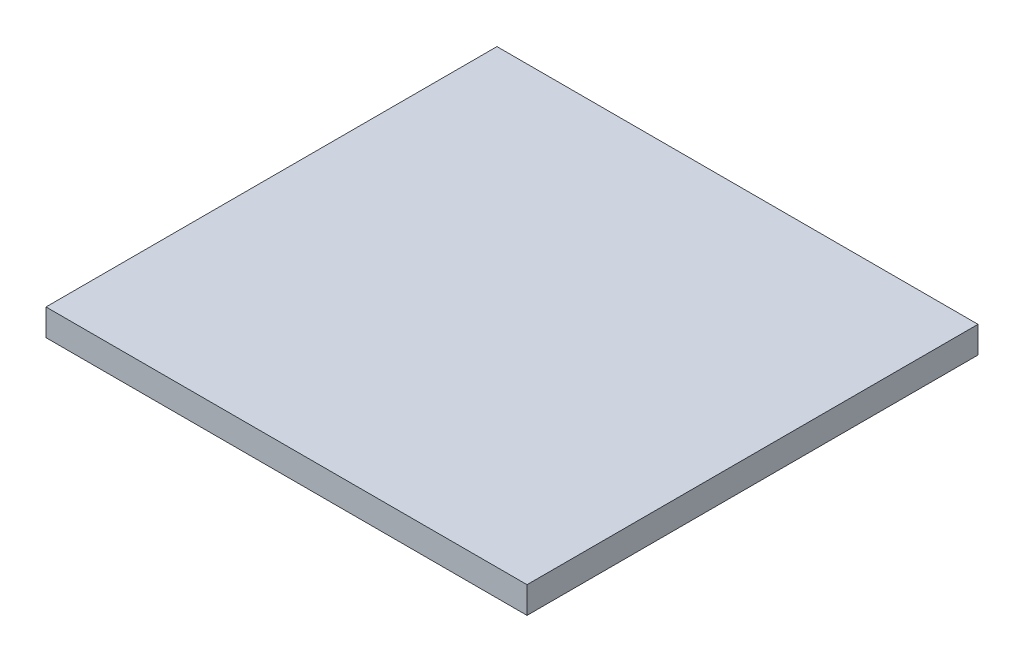
ISO-10303-21;
HEADER;
FILE_DESCRIPTION(('STEP AP214'),'2;1');
FILE_NAME('part.step','',(''),(''),'','','');
FILE_SCHEMA(('AUTOMOTIVE_DESIGN { 1 0 10303 214 1 1 1 1 }'));
ENDSEC;
DATA;
#1=APPLICATION_CONTEXT('core data for automotive mechanical design processes');
#2=APPLICATION_PROTOCOL_DEFINITION('international standard','automotive_design',2000,#1);
#3=PRODUCT_CONTEXT('',#1,'mechanical');
#4=PRODUCT('Part','Part','',(#3));
#5=PRODUCT_RELATED_PRODUCT_CATEGORY('part','',(#4));
#6=PRODUCT_DEFINITION_FORMATION('','',#4);
#7=PRODUCT_DEFINITION_CONTEXT('part definition',#1,'design');
#8=PRODUCT_DEFINITION('design','',#6,#7);
#9=PRODUCT_DEFINITION_SHAPE('','',#8);
#10=(LENGTH_UNIT() NAMED_UNIT(*) SI_UNIT(.MILLI.,.METRE.));
#11=(NAMED_UNIT(*) PLANE_ANGLE_UNIT() SI_UNIT($,.RADIAN.));
#12=(NAMED_UNIT(*) SI_UNIT($,.STERADIAN.) SOLID_ANGLE_UNIT());
#13=UNCERTAINTY_MEASURE_WITH_UNIT(LENGTH_MEASURE(1.E-05),#10,'distance_accuracy_value','');
#14=(GEOMETRIC_REPRESENTATION_CONTEXT(3) GLOBAL_UNCERTAINTY_ASSIGNED_CONTEXT((#13)) GLOBAL_UNIT_ASSIGNED_CONTEXT((#10,
#11,#12)) REPRESENTATION_CONTEXT('',''));
#15=CARTESIAN_POINT('',(0.,0.,0.));
#16=DIRECTION('',(0.,0.,1.));
#17=DIRECTION('',(1.,0.,0.));
#18=AXIS2_PLACEMENT_3D('',#15,#16,#17);
#19=CARTESIAN_POINT('',(-3.9751,2.9756,1.7526));
#20=DIRECTION('',(1.,0.,0.));
#21=DIRECTION('',(0.,-1.,0.));
#22=AXIS2_PLACEMENT_3D('',#19,#20,#21);
#23=PLANE('',#22);
#24=DIRECTION('',(0.,0.,1.));
#25=VECTOR('',#24,1.);
#26=CARTESIAN_POINT('',(-3.9751,2.9306,1.7526));
#27=LINE('',#26,#25);
#28=CARTESIAN_POINT('',(-3.9751,2.9306,0.990599999999973));
#29=VERTEX_POINT('',#28);
#30=CARTESIAN_POINT('',(-3.9751,2.9306,1.7526));
#31=VERTEX_POINT('',#30);
#32=EDGE_CURVE('E11',#29,#31,#27,.T.);
#33=ORIENTED_EDGE('',*,*,#32,.T.);
#34=DIRECTION('',(0.,-1.,0.));
#35=VECTOR('',#34,1.);
#36=CARTESIAN_POINT('',(-3.9751,2.9756,1.7526));
#37=LINE('',#36,#35);
#38=CARTESIAN_POINT('',(-3.9751,2.9756,1.7526));
#39=VERTEX_POINT('',#38);
#40=EDGE_CURVE('E24',#39,#31,#37,.T.);
#41=ORIENTED_EDGE('',*,*,#40,.F.);
#42=DIRECTION('',(0.,0.,1.));
#43=VECTOR('',#42,1.);
#44=CARTESIAN_POINT('',(-3.9751,2.9756,1.7526));
#45=LINE('',#44,#43);
#46=CARTESIAN_POINT('',(-3.9751,2.9756,0.990599999999973));
#47=VERTEX_POINT('',#46);
#48=EDGE_CURVE('E88',#47,#39,#45,.T.);
#49=ORIENTED_EDGE('',*,*,#48,.F.);
#50=DIRECTION('',(0.,-1.,0.));
#51=VECTOR('',#50,1.);
#52=CARTESIAN_POINT('',(-3.9751,2.9756,0.990599999999973));
#53=LINE('',#52,#51);
#54=EDGE_CURVE('E77',#47,#29,#53,.T.);
#55=ORIENTED_EDGE('',*,*,#54,.T.);
#56=EDGE_LOOP('',(#33,#41,#49,#55));
#57=FACE_BOUND('',#56,.T.);
#58=ADVANCED_FACE('F17',(#57),#23,.F.);
#59=CARTESIAN_POINT('',(-3.1623,2.9756,1.7526));
#60=DIRECTION('',(0.,0.,-1.));
#61=DIRECTION('',(0.,1.,0.));
#62=AXIS2_PLACEMENT_3D('',#59,#60,#61);
#63=PLANE('',#62);
#64=DIRECTION('',(1.,0.,0.));
#65=VECTOR('',#64,1.);
#66=CARTESIAN_POINT('',(-3.1623,2.9306,1.7526));
#67=LINE('',#66,#65);
#68=CARTESIAN_POINT('',(-3.1623,2.9306,1.7526));
#69=VERTEX_POINT('',#68);
#70=EDGE_CURVE('E85',#31,#69,#67,.T.);
#71=ORIENTED_EDGE('',*,*,#70,.T.);
#72=DIRECTION('',(0.,-1.,0.));
#73=VECTOR('',#72,1.);
#74=CARTESIAN_POINT('',(-3.1623,2.9756,1.7526));
#75=LINE('',#74,#73);
#76=CARTESIAN_POINT('',(-3.1623,2.9756,1.7526));
#77=VERTEX_POINT('',#76);
#78=EDGE_CURVE('E83',#77,#69,#75,.T.);
#79=ORIENTED_EDGE('',*,*,#78,.F.);
#80=DIRECTION('',(1.,0.,0.));
#81=VECTOR('',#80,1.);
#82=CARTESIAN_POINT('',(-3.1623,2.9756,1.7526));
#83=LINE('',#82,#81);
#84=EDGE_CURVE('E72',#39,#77,#83,.T.);
#85=ORIENTED_EDGE('',*,*,#84,.F.);
#86=ORIENTED_EDGE('',*,*,#40,.T.);
#87=EDGE_LOOP('',(#71,#79,#85,#86));
#88=FACE_BOUND('',#87,.T.);
#89=ADVANCED_FACE('F90',(#88),#63,.F.);
#90=CARTESIAN_POINT('',(-3.1623,2.9756,0.990599999999973));
#91=DIRECTION('',(-1.,0.,0.));
#92=DIRECTION('',(0.,1.,0.));
#93=AXIS2_PLACEMENT_3D('',#90,#91,#92);
#94=PLANE('',#93);
#95=DIRECTION('',(0.,0.,-1.));
#96=VECTOR('',#95,1.);
#97=CARTESIAN_POINT('',(-3.1623,2.9306,0.990599999999973));
#98=LINE('',#97,#96);
#99=CARTESIAN_POINT('',(-3.1623,2.9306,0.990599999999973));
#100=VERTEX_POINT('',#99);
#101=EDGE_CURVE('E60',#69,#100,#98,.T.);
#102=ORIENTED_EDGE('',*,*,#101,.T.);
#103=DIRECTION('',(0.,-1.,0.));
#104=VECTOR('',#103,1.);
#105=CARTESIAN_POINT('',(-3.1623,2.9756,0.990599999999973));
#106=LINE('',#105,#104);
#107=CARTESIAN_POINT('',(-3.1623,2.9756,0.990599999999973));
#108=VERTEX_POINT('',#107);
#109=EDGE_CURVE('E54',#108,#100,#106,.T.);
#110=ORIENTED_EDGE('',*,*,#109,.F.);
#111=DIRECTION('',(0.,0.,-1.));
#112=VECTOR('',#111,1.);
#113=CARTESIAN_POINT('',(-3.1623,2.9756,0.990599999999973));
#114=LINE('',#113,#112);
#115=EDGE_CURVE('E58',#77,#108,#114,.T.);
#116=ORIENTED_EDGE('',*,*,#115,.F.);
#117=ORIENTED_EDGE('',*,*,#78,.T.);
#118=EDGE_LOOP('',(#102,#110,#116,#117));
#119=FACE_BOUND('',#118,.T.);
#120=ADVANCED_FACE('F56',(#119),#94,.F.);
#121=CARTESIAN_POINT('',(-3.9751,2.9756,0.990599999999973));
#122=DIRECTION('',(0.,0.,1.));
#123=DIRECTION('',(0.,-1.,0.));
#124=AXIS2_PLACEMENT_3D('',#121,#122,#123);
#125=PLANE('',#124);
#126=DIRECTION('',(-1.,0.,0.));
#127=VECTOR('',#126,1.);
#128=CARTESIAN_POINT('',(-3.9751,2.9306,0.990599999999973));
#129=LINE('',#128,#127);
#130=EDGE_CURVE('E73',#100,#29,#129,.T.);
#131=ORIENTED_EDGE('',*,*,#130,.T.);
#132=ORIENTED_EDGE('',*,*,#54,.F.);
#133=DIRECTION('',(-1.,0.,0.));
#134=VECTOR('',#133,1.);
#135=CARTESIAN_POINT('',(-3.9751,2.9756,0.990599999999973));
#136=LINE('',#135,#134);
#137=EDGE_CURVE('E70',#108,#47,#136,.T.);
#138=ORIENTED_EDGE('',*,*,#137,.F.);
#139=ORIENTED_EDGE('',*,*,#109,.T.);
#140=EDGE_LOOP('',(#131,#132,#138,#139));
#141=FACE_BOUND('',#140,.T.);
#142=ADVANCED_FACE('F76',(#141),#125,.F.);
#143=CARTESIAN_POINT('',(0.,2.9756,0.));
#144=DIRECTION('',(0.,-1.,0.));
#145=DIRECTION('',(-1.,0.,0.));
#146=AXIS2_PLACEMENT_3D('',#143,#144,#145);
#147=PLANE('',#146);
#148=ORIENTED_EDGE('',*,*,#48,.T.);
#149=ORIENTED_EDGE('',*,*,#84,.T.);
#150=ORIENTED_EDGE('',*,*,#115,.T.);
#151=ORIENTED_EDGE('',*,*,#137,.T.);
#152=EDGE_LOOP('',(#148,#149,#150,#151));
#153=FACE_BOUND('',#152,.T.);
#154=ADVANCED_FACE('F69',(#153),#147,.F.);
#155=CARTESIAN_POINT('',(0.,2.9306,0.));
#156=DIRECTION('',(0.,-1.,0.));
#157=DIRECTION('',(-1.,0.,0.));
#158=AXIS2_PLACEMENT_3D('',#155,#156,#157);
#159=PLANE('',#158);
#160=ORIENTED_EDGE('',*,*,#32,.F.);
#161=ORIENTED_EDGE('',*,*,#130,.F.);
#162=ORIENTED_EDGE('',*,*,#101,.F.);
#163=ORIENTED_EDGE('',*,*,#70,.F.);
#164=EDGE_LOOP('',(#160,#161,#162,#163));
#165=FACE_BOUND('',#164,.T.);
#166=ADVANCED_FACE('F91',(#165),#159,.T.);
#167=CLOSED_SHELL('',(#58,#89,#120,#142,#154,#166));
#168=MANIFOLD_SOLID_BREP('B1',#167);
#169=ADVANCED_BREP_SHAPE_REPRESENTATION('',(#18,#168),#14);
#170=SHAPE_DEFINITION_REPRESENTATION(#9,#169);
ENDSEC;
END-ISO-10303-21;
